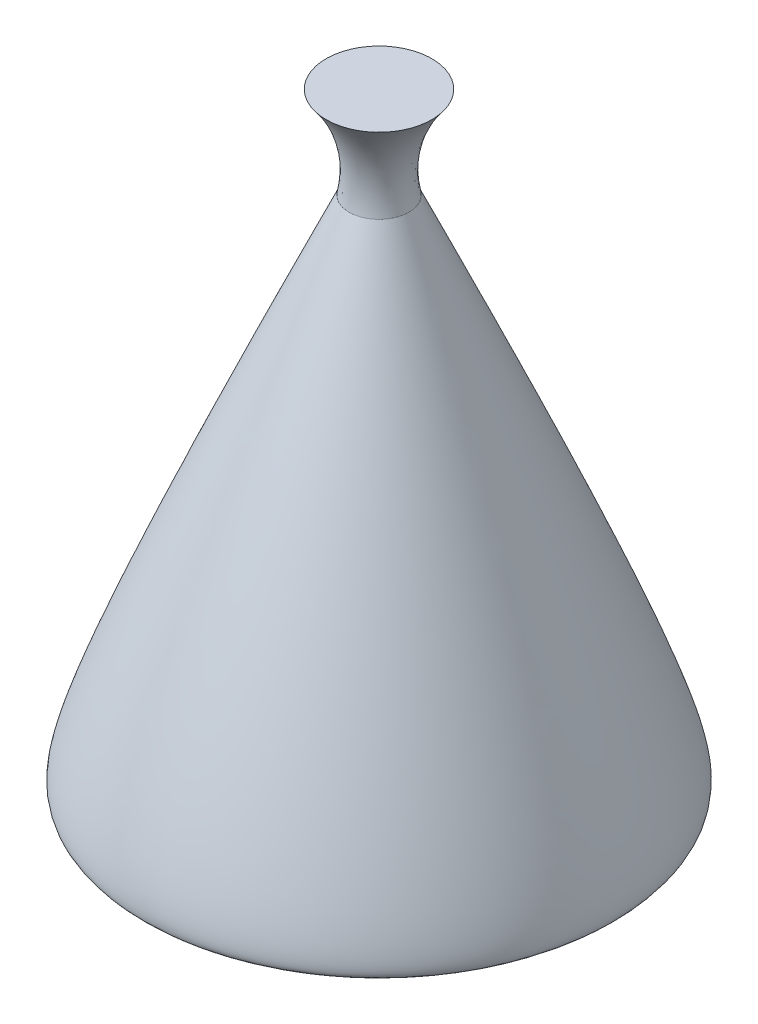
ISO-10303-21;
HEADER;
FILE_DESCRIPTION(('STEP AP214'),'2;1');
FILE_NAME('part.step','',(''),(''),'','','');
FILE_SCHEMA(('AUTOMOTIVE_DESIGN { 1 0 10303 214 1 1 1 1 }'));
ENDSEC;
DATA;
#1=APPLICATION_CONTEXT('core data for automotive mechanical design processes');
#2=APPLICATION_PROTOCOL_DEFINITION('international standard','automotive_design',2000,#1);
#3=PRODUCT_CONTEXT('',#1,'mechanical');
#4=PRODUCT('Part','Part','',(#3));
#5=PRODUCT_RELATED_PRODUCT_CATEGORY('part','',(#4));
#6=PRODUCT_DEFINITION_FORMATION('','',#4);
#7=PRODUCT_DEFINITION_CONTEXT('part definition',#1,'design');
#8=PRODUCT_DEFINITION('design','',#6,#7);
#9=PRODUCT_DEFINITION_SHAPE('','',#8);
#10=(LENGTH_UNIT() NAMED_UNIT(*) SI_UNIT(.MILLI.,.METRE.));
#11=(NAMED_UNIT(*) PLANE_ANGLE_UNIT() SI_UNIT($,.RADIAN.));
#12=(NAMED_UNIT(*) SI_UNIT($,.STERADIAN.) SOLID_ANGLE_UNIT());
#13=UNCERTAINTY_MEASURE_WITH_UNIT(LENGTH_MEASURE(1.E-05),#10,'distance_accuracy_value','');
#14=(GEOMETRIC_REPRESENTATION_CONTEXT(3) GLOBAL_UNCERTAINTY_ASSIGNED_CONTEXT((#13)) GLOBAL_UNIT_ASSIGNED_CONTEXT((#10,
#11,#12)) REPRESENTATION_CONTEXT('',''));
#15=CARTESIAN_POINT('',(0.,0.,0.));
#16=DIRECTION('',(0.,0.,1.));
#17=DIRECTION('',(1.,0.,0.));
#18=AXIS2_PLACEMENT_3D('',#15,#16,#17);
#19=CARTESIAN_POINT('',(-10.5510064512299,-21.7513868888796,0.));
#20=DIRECTION('',(0.,-1.,0.));
#21=DIRECTION('',(0.,0.,-1.));
#22=AXIS2_PLACEMENT_3D('',#19,#20,#21);
#23=PLANE('',#22);
#24=CARTESIAN_POINT('',(0.,-21.7513868888796,0.));
#25=DIRECTION('',(0.,1.,0.));
#26=DIRECTION('',(0.,0.,1.));
#27=AXIS2_PLACEMENT_3D('',#24,#25,#26);
#28=CIRCLE('',#27,10.5510064512299);
#29=CARTESIAN_POINT('',(0.,-21.7513868888796,10.5510064512299));
#30=VERTEX_POINT('',#29);
#31=EDGE_CURVE('E10',#30,#30,#28,.T.);
#32=ORIENTED_EDGE('',*,*,#31,.F.);
#33=EDGE_LOOP('',(#32));
#34=FACE_BOUND('',#33,.T.);
#35=ADVANCED_FACE('F43',(#34),#23,.T.);
#36=CARTESIAN_POINT('',(-1.36149758804875,1.66179322782441,0.));
#37=CARTESIAN_POINT('',(-11.9265856331848,-21.7513868888796,0.));
#38=CARTESIAN_POINT('',(-10.5510064512299,-21.7513868888796,0.));
#39=B_SPLINE_CURVE_WITH_KNOTS('',2,(#36,#37,#38),.UNSPECIFIED.,.F.,.F.,(3,3),(0.,1.),.UNSPECIFIED.);
#40=CARTESIAN_POINT('',(0.,10.839555672153,0.));
#41=DIRECTION('',(0.,1.,0.));
#42=AXIS1_PLACEMENT('',#40,#41);
#43=SURFACE_OF_REVOLUTION('',#39,#42);
#44=ORIENTED_EDGE('',*,*,#31,.T.);
#45=EDGE_LOOP('',(#44));
#46=FACE_BOUND('',#45,.T.);
#47=CARTESIAN_POINT('',(0.,1.66179322782441,0.));
#48=DIRECTION('',(0.,1.,0.));
#49=DIRECTION('',(0.,0.,1.));
#50=AXIS2_PLACEMENT_3D('',#47,#48,#49);
#51=CIRCLE('',#50,1.36149758804875);
#52=CARTESIAN_POINT('',(0.,1.66179322782441,1.36149758804875));
#53=VERTEX_POINT('',#52);
#54=EDGE_CURVE('E50',#53,#53,#51,.T.);
#55=ORIENTED_EDGE('',*,*,#54,.F.);
#56=EDGE_LOOP('',(#55));
#57=FACE_BOUND('',#56,.T.);
#58=ADVANCED_FACE('F72',(#46,#57),#43,.F.);
#59=CARTESIAN_POINT('',(-2.40871852140125,5.8399873421981,0.));
#60=CARTESIAN_POINT('',(-0.899570843169585,3.89110664136397,0.));
#61=CARTESIAN_POINT('',(-1.36149758804875,1.66179322782441,0.));
#62=B_SPLINE_CURVE_WITH_KNOTS('',2,(#59,#60,#61),.UNSPECIFIED.,.F.,.F.,(3,3),(0.,1.),.UNSPECIFIED.);
#63=CARTESIAN_POINT('',(0.,10.839555672153,0.));
#64=DIRECTION('',(0.,1.,0.));
#65=AXIS1_PLACEMENT('',#63,#64);
#66=SURFACE_OF_REVOLUTION('',#62,#65);
#67=ORIENTED_EDGE('',*,*,#54,.T.);
#68=EDGE_LOOP('',(#67));
#69=FACE_BOUND('',#68,.T.);
#70=CARTESIAN_POINT('',(0.,5.8399873421981,0.));
#71=DIRECTION('',(0.,1.,0.));
#72=DIRECTION('',(0.,0.,1.));
#73=AXIS2_PLACEMENT_3D('',#70,#71,#72);
#74=CIRCLE('',#73,2.40871852140125);
#75=CARTESIAN_POINT('',(0.,5.8399873421981,2.40871852140125));
#76=VERTEX_POINT('',#75);
#77=EDGE_CURVE('E55',#76,#76,#74,.T.);
#78=ORIENTED_EDGE('',*,*,#77,.F.);
#79=EDGE_LOOP('',(#78));
#80=FACE_BOUND('',#79,.T.);
#81=ADVANCED_FACE('F75',(#69,#80),#66,.F.);
#82=CARTESIAN_POINT('',(-2.40871852140125,5.8399873421981,0.));
#83=DIRECTION('',(0.,1.,0.));
#84=DIRECTION('',(0.,0.,1.));
#85=AXIS2_PLACEMENT_3D('',#82,#83,#84);
#86=PLANE('',#85);
#87=ORIENTED_EDGE('',*,*,#77,.T.);
#88=EDGE_LOOP('',(#87));
#89=FACE_BOUND('',#88,.T.);
#90=ADVANCED_FACE('F78',(#89),#86,.T.);
#91=CLOSED_SHELL('',(#35,#58,#81,#90));
#92=MANIFOLD_SOLID_BREP('B2',#91);
#93=ADVANCED_BREP_SHAPE_REPRESENTATION('',(#18,#92),#14);
#94=SHAPE_DEFINITION_REPRESENTATION(#9,#93);
ENDSEC;
END-ISO-10303-21;
